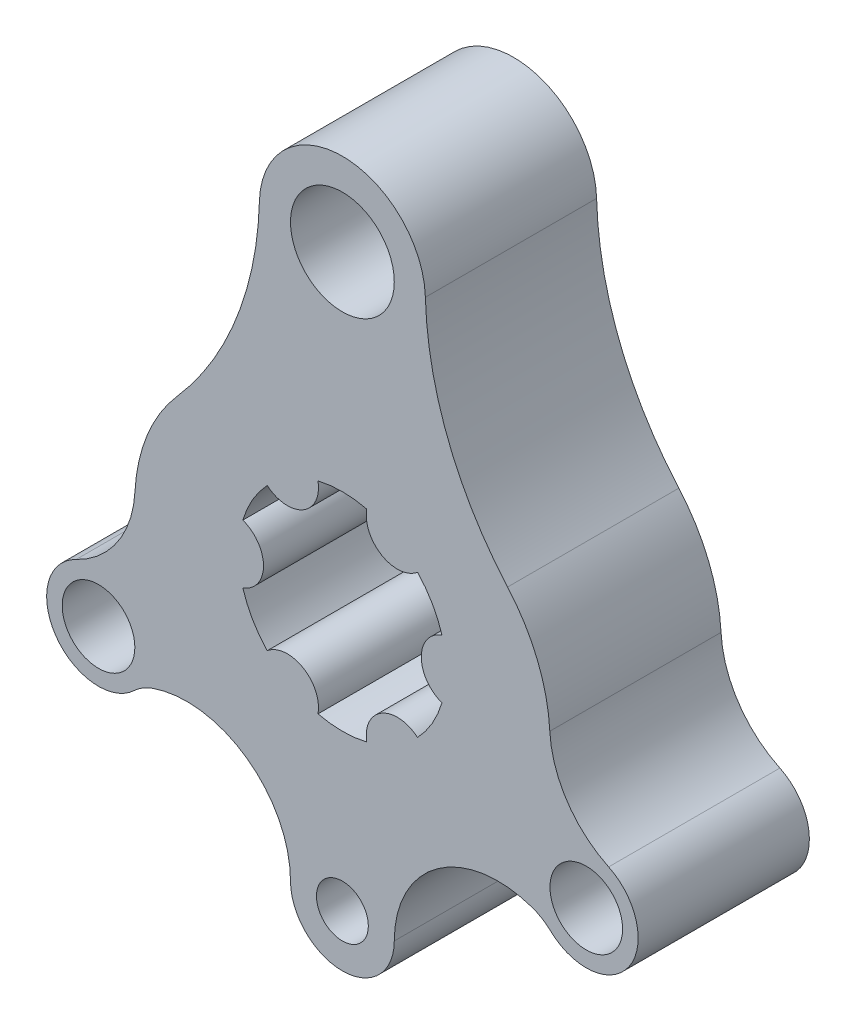
ISO-10303-21;
HEADER;
FILE_DESCRIPTION(('STEP AP214'),'2;1');
FILE_NAME('part.step','',(''),(''),'','','');
FILE_SCHEMA(('AUTOMOTIVE_DESIGN { 1 0 10303 214 1 1 1 1 }'));
ENDSEC;
DATA;
#1=APPLICATION_CONTEXT('core data for automotive mechanical design processes');
#2=APPLICATION_PROTOCOL_DEFINITION('international standard','automotive_design',2000,#1);
#3=PRODUCT_CONTEXT('',#1,'mechanical');
#4=PRODUCT('Part','Part','',(#3));
#5=PRODUCT_RELATED_PRODUCT_CATEGORY('part','',(#4));
#6=PRODUCT_DEFINITION_FORMATION('','',#4);
#7=PRODUCT_DEFINITION_CONTEXT('part definition',#1,'design');
#8=PRODUCT_DEFINITION('design','',#6,#7);
#9=PRODUCT_DEFINITION_SHAPE('','',#8);
#10=(LENGTH_UNIT() NAMED_UNIT(*) SI_UNIT(.MILLI.,.METRE.));
#11=(NAMED_UNIT(*) PLANE_ANGLE_UNIT() SI_UNIT($,.RADIAN.));
#12=(NAMED_UNIT(*) SI_UNIT($,.STERADIAN.) SOLID_ANGLE_UNIT());
#13=UNCERTAINTY_MEASURE_WITH_UNIT(LENGTH_MEASURE(1.E-05),#10,'distance_accuracy_value','');
#14=(GEOMETRIC_REPRESENTATION_CONTEXT(3) GLOBAL_UNCERTAINTY_ASSIGNED_CONTEXT((#13)) GLOBAL_UNIT_ASSIGNED_CONTEXT((#10,
#11,#12)) REPRESENTATION_CONTEXT('',''));
#15=CARTESIAN_POINT('',(0.,0.,0.));
#16=DIRECTION('',(0.,0.,1.));
#17=DIRECTION('',(1.,0.,0.));
#18=AXIS2_PLACEMENT_3D('',#15,#16,#17);
#19=CARTESIAN_POINT('',(0.,0.,33.));
#20=DIRECTION('',(0.,0.,-1.));
#21=DIRECTION('',(-1.,0.,0.));
#22=AXIS2_PLACEMENT_3D('',#19,#20,#21);
#23=CYLINDRICAL_SURFACE('',#22,20.);
#24=CARTESIAN_POINT('',(0.,0.,0.));
#25=DIRECTION('',(0.,0.,1.));
#26=DIRECTION('',(1.,0.,0.));
#27=AXIS2_PLACEMENT_3D('',#24,#25,#26);
#28=CIRCLE('',#27,20.);
#29=CARTESIAN_POINT('',(-19.1851005151871,5.65083340952174,0.));
#30=VERTEX_POINT('',#29);
#31=CARTESIAN_POINT('',(-14.486315542793,13.7893677155493,0.));
#32=VERTEX_POINT('',#31);
#33=EDGE_CURVE('E322',#30,#32,#28,.F.);
#34=ORIENTED_EDGE('',*,*,#33,.T.);
#35=DIRECTION('',(0.,0.,-1.));
#36=VECTOR('',#35,1.);
#37=CARTESIAN_POINT('',(-14.486315542793,13.7893677155493,33.));
#38=LINE('',#37,#36);
#39=CARTESIAN_POINT('',(-14.486315542793,13.7893677155493,33.));
#40=VERTEX_POINT('',#39);
#41=EDGE_CURVE('E11',#40,#32,#38,.T.);
#42=ORIENTED_EDGE('',*,*,#41,.F.);
#43=CARTESIAN_POINT('',(0.,0.,33.));
#44=DIRECTION('',(0.,0.,1.));
#45=DIRECTION('',(1.,0.,0.));
#46=AXIS2_PLACEMENT_3D('',#43,#44,#45);
#47=CIRCLE('',#46,20.);
#48=CARTESIAN_POINT('',(-19.1851005151871,5.65083340952174,33.));
#49=VERTEX_POINT('',#48);
#50=EDGE_CURVE('E556',#49,#40,#47,.F.);
#51=ORIENTED_EDGE('',*,*,#50,.F.);
#52=DIRECTION('',(0.,0.,-1.));
#53=VECTOR('',#52,1.);
#54=CARTESIAN_POINT('',(-19.1851005151871,5.65083340952174,33.));
#55=LINE('',#54,#53);
#56=EDGE_CURVE('E357',#49,#30,#55,.T.);
#57=ORIENTED_EDGE('',*,*,#56,.T.);
#58=EDGE_LOOP('',(#34,#42,#51,#57));
#59=FACE_BOUND('',#58,.T.);
#60=ADVANCED_FACE('F41',(#59),#23,.F.);
#61=CARTESIAN_POINT('',(-10.6010245728135,18.3615131723997,33.));
#62=DIRECTION('',(0.,0.,-1.));
#63=DIRECTION('',(-1.,0.,0.));
#64=AXIS2_PLACEMENT_3D('',#61,#62,#63);
#65=CYLINDRICAL_SURFACE('',#64,5.99999999999993);
#66=CARTESIAN_POINT('',(-10.6010245728135,18.3615131723997,0.));
#67=DIRECTION('',(0.,0.,1.));
#68=DIRECTION('',(1.,0.,0.));
#69=AXIS2_PLACEMENT_3D('',#66,#67,#68);
#70=CIRCLE('',#69,5.99999999999993);
#71=CARTESIAN_POINT('',(-4.69878497239411,19.4402011250708,0.));
#72=VERTEX_POINT('',#71);
#73=EDGE_CURVE('E326',#32,#72,#70,.T.);
#74=ORIENTED_EDGE('',*,*,#73,.T.);
#75=DIRECTION('',(0.,0.,-1.));
#76=VECTOR('',#75,1.);
#77=CARTESIAN_POINT('',(-4.69878497239411,19.4402011250708,33.));
#78=LINE('',#77,#76);
#79=CARTESIAN_POINT('',(-4.69878497239411,19.4402011250708,33.));
#80=VERTEX_POINT('',#79);
#81=EDGE_CURVE('E52',#80,#72,#78,.T.);
#82=ORIENTED_EDGE('',*,*,#81,.F.);
#83=CARTESIAN_POINT('',(-10.6010245728135,18.3615131723997,33.));
#84=DIRECTION('',(0.,0.,1.));
#85=DIRECTION('',(1.,0.,0.));
#86=AXIS2_PLACEMENT_3D('',#83,#84,#85);
#87=CIRCLE('',#86,5.99999999999993);
#88=EDGE_CURVE('E559',#40,#80,#87,.T.);
#89=ORIENTED_EDGE('',*,*,#88,.F.);
#90=ORIENTED_EDGE('',*,*,#41,.T.);
#91=EDGE_LOOP('',(#74,#82,#89,#90));
#92=FACE_BOUND('',#91,.T.);
#93=ADVANCED_FACE('F609',(#92),#65,.T.);
#94=CARTESIAN_POINT('',(0.,0.,33.));
#95=DIRECTION('',(0.,0.,-1.));
#96=DIRECTION('',(-1.,0.,0.));
#97=AXIS2_PLACEMENT_3D('',#94,#95,#96);
#98=CYLINDRICAL_SURFACE('',#97,20.);
#99=CARTESIAN_POINT('',(0.,0.,0.));
#100=DIRECTION('',(0.,0.,1.));
#101=DIRECTION('',(1.,0.,0.));
#102=AXIS2_PLACEMENT_3D('',#99,#100,#101);
#103=CIRCLE('',#102,20.);
#104=CARTESIAN_POINT('',(4.69878497239398,19.4402011250708,0.));
#105=VERTEX_POINT('',#104);
#106=EDGE_CURVE('E329',#72,#105,#103,.F.);
#107=ORIENTED_EDGE('',*,*,#106,.T.);
#108=DIRECTION('',(0.,0.,-1.));
#109=VECTOR('',#108,1.);
#110=CARTESIAN_POINT('',(4.69878497239398,19.4402011250708,33.));
#111=LINE('',#110,#109);
#112=CARTESIAN_POINT('',(4.69878497239398,19.4402011250708,33.));
#113=VERTEX_POINT('',#112);
#114=EDGE_CURVE('E384',#113,#105,#111,.T.);
#115=ORIENTED_EDGE('',*,*,#114,.F.);
#116=CARTESIAN_POINT('',(0.,0.,33.));
#117=DIRECTION('',(0.,0.,1.));
#118=DIRECTION('',(1.,0.,0.));
#119=AXIS2_PLACEMENT_3D('',#116,#117,#118);
#120=CIRCLE('',#119,20.);
#121=EDGE_CURVE('E562',#80,#113,#120,.F.);
#122=ORIENTED_EDGE('',*,*,#121,.F.);
#123=ORIENTED_EDGE('',*,*,#81,.T.);
#124=EDGE_LOOP('',(#107,#115,#122,#123));
#125=FACE_BOUND('',#124,.T.);
#126=ADVANCED_FACE('F614',(#125),#98,.F.);
#127=CARTESIAN_POINT('',(10.6010245728138,18.3615131723996,33.));
#128=DIRECTION('',(0.,0.,-1.));
#129=DIRECTION('',(-1.,0.,0.));
#130=AXIS2_PLACEMENT_3D('',#127,#128,#129);
#131=CYLINDRICAL_SURFACE('',#130,6.00000000000007);
#132=CARTESIAN_POINT('',(10.6010245728138,18.3615131723996,0.));
#133=DIRECTION('',(0.,0.,1.));
#134=DIRECTION('',(1.,0.,0.));
#135=AXIS2_PLACEMENT_3D('',#132,#133,#134);
#136=CIRCLE('',#135,6.00000000000007);
#137=CARTESIAN_POINT('',(14.4863155427931,13.7893677155492,0.));
#138=VERTEX_POINT('',#137);
#139=EDGE_CURVE('E332',#105,#138,#136,.T.);
#140=ORIENTED_EDGE('',*,*,#139,.T.);
#141=DIRECTION('',(0.,0.,-1.));
#142=VECTOR('',#141,1.);
#143=CARTESIAN_POINT('',(14.4863155427931,13.7893677155492,33.));
#144=LINE('',#143,#142);
#145=CARTESIAN_POINT('',(14.4863155427931,13.7893677155492,33.));
#146=VERTEX_POINT('',#145);
#147=EDGE_CURVE('E380',#146,#138,#144,.T.);
#148=ORIENTED_EDGE('',*,*,#147,.F.);
#149=CARTESIAN_POINT('',(10.6010245728138,18.3615131723996,33.));
#150=DIRECTION('',(0.,0.,1.));
#151=DIRECTION('',(1.,0.,0.));
#152=AXIS2_PLACEMENT_3D('',#149,#150,#151);
#153=CIRCLE('',#152,6.00000000000007);
#154=EDGE_CURVE('E565',#113,#146,#153,.T.);
#155=ORIENTED_EDGE('',*,*,#154,.F.);
#156=ORIENTED_EDGE('',*,*,#114,.T.);
#157=EDGE_LOOP('',(#140,#148,#155,#156));
#158=FACE_BOUND('',#157,.T.);
#159=ADVANCED_FACE('F684',(#158),#131,.T.);
#160=CARTESIAN_POINT('',(0.,0.,33.));
#161=DIRECTION('',(0.,0.,-1.));
#162=DIRECTION('',(-1.,0.,0.));
#163=AXIS2_PLACEMENT_3D('',#160,#161,#162);
#164=CYLINDRICAL_SURFACE('',#163,20.);
#165=CARTESIAN_POINT('',(0.,0.,0.));
#166=DIRECTION('',(0.,0.,1.));
#167=DIRECTION('',(1.,0.,0.));
#168=AXIS2_PLACEMENT_3D('',#165,#166,#167);
#169=CIRCLE('',#168,20.);
#170=CARTESIAN_POINT('',(19.1851005151871,5.6508334095216,0.));
#171=VERTEX_POINT('',#170);
#172=EDGE_CURVE('E335',#138,#171,#169,.F.);
#173=ORIENTED_EDGE('',*,*,#172,.T.);
#174=DIRECTION('',(0.,0.,-1.));
#175=VECTOR('',#174,1.);
#176=CARTESIAN_POINT('',(19.1851005151871,5.6508334095216,33.));
#177=LINE('',#176,#175);
#178=CARTESIAN_POINT('',(19.1851005151871,5.6508334095216,33.));
#179=VERTEX_POINT('',#178);
#180=EDGE_CURVE('E376',#179,#171,#177,.T.);
#181=ORIENTED_EDGE('',*,*,#180,.F.);
#182=CARTESIAN_POINT('',(0.,0.,33.));
#183=DIRECTION('',(0.,0.,1.));
#184=DIRECTION('',(1.,0.,0.));
#185=AXIS2_PLACEMENT_3D('',#182,#183,#184);
#186=CIRCLE('',#185,20.);
#187=EDGE_CURVE('E568',#146,#179,#186,.F.);
#188=ORIENTED_EDGE('',*,*,#187,.F.);
#189=ORIENTED_EDGE('',*,*,#147,.T.);
#190=EDGE_LOOP('',(#173,#181,#188,#189));
#191=FACE_BOUND('',#190,.T.);
#192=ADVANCED_FACE('F680',(#191),#164,.F.);
#193=CARTESIAN_POINT('',(21.2020491456275,0.,33.));
#194=DIRECTION('',(0.,0.,-1.));
#195=DIRECTION('',(-1.,0.,0.));
#196=AXIS2_PLACEMENT_3D('',#193,#194,#195);
#197=CYLINDRICAL_SURFACE('',#196,6.00000000000008);
#198=CARTESIAN_POINT('',(21.2020491456275,0.,0.));
#199=DIRECTION('',(0.,0.,1.));
#200=DIRECTION('',(1.,0.,0.));
#201=AXIS2_PLACEMENT_3D('',#198,#199,#200);
#202=CIRCLE('',#201,6.00000000000008);
#203=CARTESIAN_POINT('',(19.1851005151871,-5.65083340952161,0.));
#204=VERTEX_POINT('',#203);
#205=EDGE_CURVE('E338',#171,#204,#202,.T.);
#206=ORIENTED_EDGE('',*,*,#205,.T.);
#207=DIRECTION('',(0.,0.,-1.));
#208=VECTOR('',#207,1.);
#209=CARTESIAN_POINT('',(19.1851005151871,-5.65083340952161,33.));
#210=LINE('',#209,#208);
#211=CARTESIAN_POINT('',(19.1851005151871,-5.65083340952161,33.));
#212=VERTEX_POINT('',#211);
#213=EDGE_CURVE('E372',#212,#204,#210,.T.);
#214=ORIENTED_EDGE('',*,*,#213,.F.);
#215=CARTESIAN_POINT('',(21.2020491456275,0.,33.));
#216=DIRECTION('',(0.,0.,1.));
#217=DIRECTION('',(1.,0.,0.));
#218=AXIS2_PLACEMENT_3D('',#215,#216,#217);
#219=CIRCLE('',#218,6.00000000000008);
#220=EDGE_CURVE('E571',#179,#212,#219,.T.);
#221=ORIENTED_EDGE('',*,*,#220,.F.);
#222=ORIENTED_EDGE('',*,*,#180,.T.);
#223=EDGE_LOOP('',(#206,#214,#221,#222));
#224=FACE_BOUND('',#223,.T.);
#225=ADVANCED_FACE('F676',(#224),#197,.T.);
#226=CARTESIAN_POINT('',(0.,0.,33.));
#227=DIRECTION('',(0.,0.,-1.));
#228=DIRECTION('',(-1.,0.,0.));
#229=AXIS2_PLACEMENT_3D('',#226,#227,#228);
#230=CYLINDRICAL_SURFACE('',#229,20.);
#231=CARTESIAN_POINT('',(0.,0.,0.));
#232=DIRECTION('',(0.,0.,1.));
#233=DIRECTION('',(1.,0.,0.));
#234=AXIS2_PLACEMENT_3D('',#231,#232,#233);
#235=CIRCLE('',#234,20.);
#236=CARTESIAN_POINT('',(14.4863155427931,-13.7893677155492,0.));
#237=VERTEX_POINT('',#236);
#238=EDGE_CURVE('E341',#204,#237,#235,.F.);
#239=ORIENTED_EDGE('',*,*,#238,.T.);
#240=DIRECTION('',(0.,0.,-1.));
#241=VECTOR('',#240,1.);
#242=CARTESIAN_POINT('',(14.4863155427931,-13.7893677155492,33.));
#243=LINE('',#242,#241);
#244=CARTESIAN_POINT('',(14.4863155427931,-13.7893677155492,33.));
#245=VERTEX_POINT('',#244);
#246=EDGE_CURVE('E368',#245,#237,#243,.T.);
#247=ORIENTED_EDGE('',*,*,#246,.F.);
#248=CARTESIAN_POINT('',(0.,0.,33.));
#249=DIRECTION('',(0.,0.,1.));
#250=DIRECTION('',(1.,0.,0.));
#251=AXIS2_PLACEMENT_3D('',#248,#249,#250);
#252=CIRCLE('',#251,20.);
#253=EDGE_CURVE('E574',#212,#245,#252,.F.);
#254=ORIENTED_EDGE('',*,*,#253,.F.);
#255=ORIENTED_EDGE('',*,*,#213,.T.);
#256=EDGE_LOOP('',(#239,#247,#254,#255));
#257=FACE_BOUND('',#256,.T.);
#258=ADVANCED_FACE('F673',(#257),#230,.F.);
#259=CARTESIAN_POINT('',(10.6010245728136,-18.3615131723997,33.));
#260=DIRECTION('',(0.,0.,-1.));
#261=DIRECTION('',(-1.,0.,0.));
#262=AXIS2_PLACEMENT_3D('',#259,#260,#261);
#263=CYLINDRICAL_SURFACE('',#262,6.00000000000007);
#264=CARTESIAN_POINT('',(10.6010245728136,-18.3615131723997,0.));
#265=DIRECTION('',(0.,0.,1.));
#266=DIRECTION('',(1.,0.,0.));
#267=AXIS2_PLACEMENT_3D('',#264,#265,#266);
#268=CIRCLE('',#267,6.00000000000007);
#269=CARTESIAN_POINT('',(4.69878497239398,-19.4402011250708,0.));
#270=VERTEX_POINT('',#269);
#271=EDGE_CURVE('E344',#237,#270,#268,.T.);
#272=ORIENTED_EDGE('',*,*,#271,.T.);
#273=DIRECTION('',(0.,0.,-1.));
#274=VECTOR('',#273,1.);
#275=CARTESIAN_POINT('',(4.69878497239398,-19.4402011250708,33.));
#276=LINE('',#275,#274);
#277=CARTESIAN_POINT('',(4.69878497239398,-19.4402011250708,33.));
#278=VERTEX_POINT('',#277);
#279=EDGE_CURVE('E364',#278,#270,#276,.T.);
#280=ORIENTED_EDGE('',*,*,#279,.F.);
#281=CARTESIAN_POINT('',(10.6010245728136,-18.3615131723997,33.));
#282=DIRECTION('',(0.,0.,1.));
#283=DIRECTION('',(1.,0.,0.));
#284=AXIS2_PLACEMENT_3D('',#281,#282,#283);
#285=CIRCLE('',#284,6.00000000000007);
#286=EDGE_CURVE('E577',#245,#278,#285,.T.);
#287=ORIENTED_EDGE('',*,*,#286,.F.);
#288=ORIENTED_EDGE('',*,*,#246,.T.);
#289=EDGE_LOOP('',(#272,#280,#287,#288));
#290=FACE_BOUND('',#289,.T.);
#291=ADVANCED_FACE('F585',(#290),#263,.T.);
#292=CARTESIAN_POINT('',(0.,0.,33.));
#293=DIRECTION('',(0.,0.,-1.));
#294=DIRECTION('',(-1.,0.,0.));
#295=AXIS2_PLACEMENT_3D('',#292,#293,#294);
#296=CYLINDRICAL_SURFACE('',#295,20.);
#297=CARTESIAN_POINT('',(0.,0.,0.));
#298=DIRECTION('',(0.,0.,1.));
#299=DIRECTION('',(1.,0.,0.));
#300=AXIS2_PLACEMENT_3D('',#297,#298,#299);
#301=CIRCLE('',#300,20.);
#302=CARTESIAN_POINT('',(-4.69878497239411,-19.4402011250708,0.));
#303=VERTEX_POINT('',#302);
#304=EDGE_CURVE('E347',#270,#303,#301,.F.);
#305=ORIENTED_EDGE('',*,*,#304,.T.);
#306=DIRECTION('',(0.,0.,-1.));
#307=VECTOR('',#306,1.);
#308=CARTESIAN_POINT('',(-4.69878497239411,-19.4402011250708,33.));
#309=LINE('',#308,#307);
#310=CARTESIAN_POINT('',(-4.69878497239411,-19.4402011250708,33.));
#311=VERTEX_POINT('',#310);
#312=EDGE_CURVE('E243',#311,#303,#309,.T.);
#313=ORIENTED_EDGE('',*,*,#312,.F.);
#314=CARTESIAN_POINT('',(0.,0.,33.));
#315=DIRECTION('',(0.,0.,1.));
#316=DIRECTION('',(1.,0.,0.));
#317=AXIS2_PLACEMENT_3D('',#314,#315,#316);
#318=CIRCLE('',#317,20.);
#319=EDGE_CURVE('E232',#278,#311,#318,.F.);
#320=ORIENTED_EDGE('',*,*,#319,.F.);
#321=ORIENTED_EDGE('',*,*,#279,.T.);
#322=EDGE_LOOP('',(#305,#313,#320,#321));
#323=FACE_BOUND('',#322,.T.);
#324=ADVANCED_FACE('F589',(#323),#296,.F.);
#325=CARTESIAN_POINT('',(-10.6010245728139,-18.3615131723995,33.));
#326=DIRECTION('',(0.,0.,-1.));
#327=DIRECTION('',(-1.,0.,0.));
#328=AXIS2_PLACEMENT_3D('',#325,#326,#327);
#329=CYLINDRICAL_SURFACE('',#328,6.00000000000007);
#330=CARTESIAN_POINT('',(-10.6010245728139,-18.3615131723995,0.));
#331=DIRECTION('',(0.,0.,1.));
#332=DIRECTION('',(1.,0.,0.));
#333=AXIS2_PLACEMENT_3D('',#330,#331,#332);
#334=CIRCLE('',#333,6.00000000000007);
#335=CARTESIAN_POINT('',(-14.4863155427932,-13.7893677155491,0.));
#336=VERTEX_POINT('',#335);
#337=EDGE_CURVE('E241',#303,#336,#334,.T.);
#338=ORIENTED_EDGE('',*,*,#337,.T.);
#339=DIRECTION('',(0.,0.,-1.));
#340=VECTOR('',#339,1.);
#341=CARTESIAN_POINT('',(-14.4863155427932,-13.7893677155491,33.));
#342=LINE('',#341,#340);
#343=CARTESIAN_POINT('',(-14.4863155427932,-13.7893677155491,33.));
#344=VERTEX_POINT('',#343);
#345=EDGE_CURVE('E238',#344,#336,#342,.T.);
#346=ORIENTED_EDGE('',*,*,#345,.F.);
#347=CARTESIAN_POINT('',(-10.6010245728139,-18.3615131723995,33.));
#348=DIRECTION('',(0.,0.,1.));
#349=DIRECTION('',(1.,0.,0.));
#350=AXIS2_PLACEMENT_3D('',#347,#348,#349);
#351=CIRCLE('',#350,6.00000000000007);
#352=EDGE_CURVE('E226',#311,#344,#351,.T.);
#353=ORIENTED_EDGE('',*,*,#352,.F.);
#354=ORIENTED_EDGE('',*,*,#312,.T.);
#355=EDGE_LOOP('',(#338,#346,#353,#354));
#356=FACE_BOUND('',#355,.T.);
#357=ADVANCED_FACE('F239',(#356),#329,.T.);
#358=CARTESIAN_POINT('',(0.,0.,33.));
#359=DIRECTION('',(0.,0.,-1.));
#360=DIRECTION('',(-1.,0.,0.));
#361=AXIS2_PLACEMENT_3D('',#358,#359,#360);
#362=CYLINDRICAL_SURFACE('',#361,20.);
#363=CARTESIAN_POINT('',(0.,0.,0.));
#364=DIRECTION('',(0.,0.,1.));
#365=DIRECTION('',(1.,0.,0.));
#366=AXIS2_PLACEMENT_3D('',#363,#364,#365);
#367=CIRCLE('',#366,20.);
#368=CARTESIAN_POINT('',(-19.1851005151872,-5.65083340952147,0.));
#369=VERTEX_POINT('',#368);
#370=EDGE_CURVE('E144',#336,#369,#367,.F.);
#371=ORIENTED_EDGE('',*,*,#370,.T.);
#372=DIRECTION('',(0.,0.,-1.));
#373=VECTOR('',#372,1.);
#374=CARTESIAN_POINT('',(-19.1851005151872,-5.65083340952147,33.));
#375=LINE('',#374,#373);
#376=CARTESIAN_POINT('',(-19.1851005151872,-5.65083340952147,33.));
#377=VERTEX_POINT('',#376);
#378=EDGE_CURVE('E244',#377,#369,#375,.T.);
#379=ORIENTED_EDGE('',*,*,#378,.F.);
#380=CARTESIAN_POINT('',(0.,0.,33.));
#381=DIRECTION('',(0.,0.,1.));
#382=DIRECTION('',(1.,0.,0.));
#383=AXIS2_PLACEMENT_3D('',#380,#381,#382);
#384=CIRCLE('',#383,20.);
#385=EDGE_CURVE('E230',#344,#377,#384,.F.);
#386=ORIENTED_EDGE('',*,*,#385,.F.);
#387=ORIENTED_EDGE('',*,*,#345,.T.);
#388=EDGE_LOOP('',(#371,#379,#386,#387));
#389=FACE_BOUND('',#388,.T.);
#390=ADVANCED_FACE('F246',(#389),#362,.F.);
#391=CARTESIAN_POINT('',(0.,60.,33.));
#392=DIRECTION('',(0.,0.,-1.));
#393=DIRECTION('',(-1.,0.,0.));
#394=AXIS2_PLACEMENT_3D('',#391,#392,#393);
#395=CYLINDRICAL_SURFACE('',#394,16.);
#396=CARTESIAN_POINT('',(0.,60.,0.));
#397=DIRECTION('',(0.,0.,1.));
#398=DIRECTION('',(1.,0.,0.));
#399=AXIS2_PLACEMENT_3D('',#396,#397,#398);
#400=CIRCLE('',#399,16.);
#401=CARTESIAN_POINT('',(-15.9940333687137,60.4369171551578,0.));
#402=VERTEX_POINT('',#401);
#403=CARTESIAN_POINT('',(15.9940333687137,60.436917155158,0.));
#404=VERTEX_POINT('',#403);
#405=EDGE_CURVE('E254',#402,#404,#400,.F.);
#406=ORIENTED_EDGE('',*,*,#405,.F.);
#407=DIRECTION('',(0.,0.,-1.));
#408=VECTOR('',#407,1.);
#409=CARTESIAN_POINT('',(-15.9940333687137,60.4369171551578,33.));
#410=LINE('',#409,#408);
#411=CARTESIAN_POINT('',(-15.9940333687137,60.4369171551578,33.));
#412=VERTEX_POINT('',#411);
#413=EDGE_CURVE('E45',#412,#402,#410,.T.);
#414=ORIENTED_EDGE('',*,*,#413,.F.);
#415=CARTESIAN_POINT('',(0.,60.,33.));
#416=DIRECTION('',(0.,0.,1.));
#417=DIRECTION('',(1.,0.,0.));
#418=AXIS2_PLACEMENT_3D('',#415,#416,#417);
#419=CIRCLE('',#418,16.);
#420=CARTESIAN_POINT('',(15.9940333687137,60.436917155158,33.));
#421=VERTEX_POINT('',#420);
#422=EDGE_CURVE('E356',#412,#421,#419,.F.);
#423=ORIENTED_EDGE('',*,*,#422,.T.);
#424=DIRECTION('',(0.,0.,-1.));
#425=VECTOR('',#424,1.);
#426=CARTESIAN_POINT('',(15.9940333687137,60.436917155158,33.));
#427=LINE('',#426,#425);
#428=EDGE_CURVE('E250',#421,#404,#427,.T.);
#429=ORIENTED_EDGE('',*,*,#428,.T.);
#430=EDGE_LOOP('',(#406,#414,#423,#429));
#431=FACE_BOUND('',#430,.T.);
#432=ADVANCED_FACE('F43',(#431),#395,.T.);
#433=CARTESIAN_POINT('',(-79.9701668435691,62.1845857757893,33.));
#434=DIRECTION('',(0.,0.,-1.));
#435=DIRECTION('',(-1.,0.,0.));
#436=AXIS2_PLACEMENT_3D('',#433,#434,#435);
#437=CYLINDRICAL_SURFACE('',#436,63.9999999999999);
#438=CARTESIAN_POINT('',(-79.9701668435691,62.1845857757893,0.));
#439=DIRECTION('',(0.,0.,1.));
#440=DIRECTION('',(1.,0.,0.));
#441=AXIS2_PLACEMENT_3D('',#438,#439,#440);
#442=CIRCLE('',#441,63.9999999999999);
#443=CARTESIAN_POINT('',(-31.8405426717033,19.9999999999998,0.));
#444=VERTEX_POINT('',#443);
#445=EDGE_CURVE('E258',#402,#444,#442,.F.);
#446=ORIENTED_EDGE('',*,*,#445,.T.);
#447=DIRECTION('',(0.,0.,-1.));
#448=VECTOR('',#447,1.);
#449=CARTESIAN_POINT('',(-31.8405426717033,19.9999999999998,33.));
#450=LINE('',#449,#448);
#451=CARTESIAN_POINT('',(-31.8405426717033,19.9999999999998,33.));
#452=VERTEX_POINT('',#451);
#453=EDGE_CURVE('E428',#452,#444,#450,.T.);
#454=ORIENTED_EDGE('',*,*,#453,.F.);
#455=CARTESIAN_POINT('',(-79.9701668435691,62.1845857757893,33.));
#456=DIRECTION('',(0.,0.,1.));
#457=DIRECTION('',(1.,0.,0.));
#458=AXIS2_PLACEMENT_3D('',#455,#456,#457);
#459=CIRCLE('',#458,63.9999999999999);
#460=EDGE_CURVE('E439',#412,#452,#459,.F.);
#461=ORIENTED_EDGE('',*,*,#460,.F.);
#462=ORIENTED_EDGE('',*,*,#413,.T.);
#463=EDGE_LOOP('',(#446,#454,#461,#462));
#464=FACE_BOUND('',#463,.T.);
#465=ADVANCED_FACE('F438',(#464),#437,.F.);
#466=CARTESIAN_POINT('',(-7.02370520808498,-1.75142704064168,33.));
#467=DIRECTION('',(0.,0.,-1.));
#468=DIRECTION('',(-1.,0.,0.));
#469=AXIS2_PLACEMENT_3D('',#466,#467,#468);
#470=CYLINDRICAL_SURFACE('',#469,33.);
#471=CARTESIAN_POINT('',(-7.02370520808498,-1.75142704064168,0.));
#472=DIRECTION('',(0.,0.,1.));
#473=DIRECTION('',(1.,0.,0.));
#474=AXIS2_PLACEMENT_3D('',#471,#472,#473);
#475=CIRCLE('',#474,33.);
#476=CARTESIAN_POINT('',(-39.9771952102275,-2.15322551455621E-13,0.));
#477=VERTEX_POINT('',#476);
#478=EDGE_CURVE('E261',#444,#477,#475,.T.);
#479=ORIENTED_EDGE('',*,*,#478,.T.);
#480=DIRECTION('',(0.,0.,-1.));
#481=VECTOR('',#480,1.);
#482=CARTESIAN_POINT('',(-39.9771952102275,-2.15322551455621E-13,33.));
#483=LINE('',#482,#481);
#484=CARTESIAN_POINT('',(-39.9771952102275,-2.15322551455621E-13,33.));
#485=VERTEX_POINT('',#484);
#486=EDGE_CURVE('E425',#485,#477,#483,.T.);
#487=ORIENTED_EDGE('',*,*,#486,.F.);
#488=CARTESIAN_POINT('',(-7.02370520808498,-1.75142704064168,33.));
#489=DIRECTION('',(0.,0.,1.));
#490=DIRECTION('',(1.,0.,0.));
#491=AXIS2_PLACEMENT_3D('',#488,#489,#490);
#492=CIRCLE('',#491,33.);
#493=EDGE_CURVE('E505',#452,#485,#492,.T.);
#494=ORIENTED_EDGE('',*,*,#493,.F.);
#495=ORIENTED_EDGE('',*,*,#453,.T.);
#496=EDGE_LOOP('',(#479,#487,#494,#495));
#497=FACE_BOUND('',#496,.T.);
#498=ADVANCED_FACE('F504',(#497),#470,.T.);
#499=CARTESIAN_POINT('',(-59.9490073327382,1.06147093372178,33.));
#500=DIRECTION('',(0.,0.,-1.));
#501=DIRECTION('',(-1.,0.,0.));
#502=AXIS2_PLACEMENT_3D('',#499,#500,#501);
#503=CYLINDRICAL_SURFACE('',#502,20.);
#504=CARTESIAN_POINT('',(-59.9490073327382,1.06147093372178,0.));
#505=DIRECTION('',(0.,0.,1.));
#506=DIRECTION('',(1.,0.,0.));
#507=AXIS2_PLACEMENT_3D('',#504,#505,#506);
#508=CIRCLE('',#507,20.);
#509=CARTESIAN_POINT('',(-51.3163357775793,-16.9795096887596,0.));
#510=VERTEX_POINT('',#509);
#511=EDGE_CURVE('E264',#477,#510,#508,.F.);
#512=ORIENTED_EDGE('',*,*,#511,.T.);
#513=DIRECTION('',(0.,0.,-1.));
#514=VECTOR('',#513,1.);
#515=CARTESIAN_POINT('',(-51.3163357775793,-16.9795096887596,33.));
#516=LINE('',#515,#514);
#517=CARTESIAN_POINT('',(-51.3163357775793,-16.9795096887596,33.));
#518=VERTEX_POINT('',#517);
#519=EDGE_CURVE('E421',#518,#510,#516,.T.);
#520=ORIENTED_EDGE('',*,*,#519,.F.);
#521=CARTESIAN_POINT('',(-59.9490073327382,1.06147093372178,33.));
#522=DIRECTION('',(0.,0.,1.));
#523=DIRECTION('',(1.,0.,0.));
#524=AXIS2_PLACEMENT_3D('',#521,#522,#523);
#525=CIRCLE('',#524,20.);
#526=EDGE_CURVE('E503',#485,#518,#525,.F.);
#527=ORIENTED_EDGE('',*,*,#526,.F.);
#528=ORIENTED_EDGE('',*,*,#486,.T.);
#529=EDGE_LOOP('',(#512,#520,#527,#528));
#530=FACE_BOUND('',#529,.T.);
#531=ADVANCED_FACE('F500',(#530),#503,.F.);
#532=CARTESIAN_POINT('',(-46.9999999999998,-26.0000000000002,33.));
#533=DIRECTION('',(0.,0.,-1.));
#534=DIRECTION('',(-1.,0.,0.));
#535=AXIS2_PLACEMENT_3D('',#532,#533,#534);
#536=CYLINDRICAL_SURFACE('',#535,9.99999999999994);
#537=CARTESIAN_POINT('',(-46.9999999999998,-26.0000000000002,0.));
#538=DIRECTION('',(0.,0.,1.));
#539=DIRECTION('',(1.,0.,0.));
#540=AXIS2_PLACEMENT_3D('',#537,#538,#539);
#541=CIRCLE('',#540,9.99999999999994);
#542=CARTESIAN_POINT('',(-40.1410010516561,-33.2769590782569,0.));
#543=VERTEX_POINT('',#542);
#544=EDGE_CURVE('E267',#510,#543,#541,.T.);
#545=ORIENTED_EDGE('',*,*,#544,.T.);
#546=DIRECTION('',(0.,0.,-1.));
#547=VECTOR('',#546,1.);
#548=CARTESIAN_POINT('',(-40.1410010516561,-33.2769590782569,33.));
#549=LINE('',#548,#547);
#550=CARTESIAN_POINT('',(-40.1410010516561,-33.2769590782569,33.));
#551=VERTEX_POINT('',#550);
#552=EDGE_CURVE('E418',#551,#543,#549,.T.);
#553=ORIENTED_EDGE('',*,*,#552,.F.);
#554=CARTESIAN_POINT('',(-46.9999999999998,-26.0000000000002,33.));
#555=DIRECTION('',(0.,0.,1.));
#556=DIRECTION('',(1.,0.,0.));
#557=AXIS2_PLACEMENT_3D('',#554,#555,#556);
#558=CIRCLE('',#557,9.99999999999994);
#559=EDGE_CURVE('E511',#518,#551,#558,.T.);
#560=ORIENTED_EDGE('',*,*,#559,.F.);
#561=ORIENTED_EDGE('',*,*,#519,.T.);
#562=EDGE_LOOP('',(#545,#553,#560,#561));
#563=FACE_BOUND('',#562,.T.);
#564=ADVANCED_FACE('F497',(#563),#536,.T.);
#565=CARTESIAN_POINT('',(-33.2820021033125,-40.5539181565134,33.));
#566=DIRECTION('',(0.,0.,-1.));
#567=DIRECTION('',(-1.,0.,0.));
#568=AXIS2_PLACEMENT_3D('',#565,#566,#567);
#569=CYLINDRICAL_SURFACE('',#568,10.);
#570=CARTESIAN_POINT('',(-33.2820021033125,-40.5539181565134,0.));
#571=DIRECTION('',(0.,0.,1.));
#572=DIRECTION('',(1.,0.,0.));
#573=AXIS2_PLACEMENT_3D('',#570,#571,#572);
#574=CIRCLE('',#573,10.);
#575=CARTESIAN_POINT('',(-36.5640042066253,-31.1078363130267,0.));
#576=VERTEX_POINT('',#575);
#577=EDGE_CURVE('E271',#576,#543,#574,.T.);
#578=ORIENTED_EDGE('',*,*,#577,.F.);
#579=DIRECTION('',(0.,0.,-1.));
#580=VECTOR('',#579,1.);
#581=CARTESIAN_POINT('',(-36.5640042066253,-31.1078363130267,33.));
#582=LINE('',#581,#580);
#583=CARTESIAN_POINT('',(-36.5640042066253,-31.1078363130267,33.));
#584=VERTEX_POINT('',#583);
#585=EDGE_CURVE('E415',#584,#576,#582,.T.);
#586=ORIENTED_EDGE('',*,*,#585,.F.);
#587=CARTESIAN_POINT('',(-33.2820021033125,-40.5539181565134,33.));
#588=DIRECTION('',(0.,0.,1.));
#589=DIRECTION('',(1.,0.,0.));
#590=AXIS2_PLACEMENT_3D('',#587,#588,#589);
#591=CIRCLE('',#590,10.);
#592=EDGE_CURVE('E494',#584,#551,#591,.T.);
#593=ORIENTED_EDGE('',*,*,#592,.T.);
#594=ORIENTED_EDGE('',*,*,#552,.T.);
#595=EDGE_LOOP('',(#578,#586,#593,#594));
#596=FACE_BOUND('',#595,.T.);
#597=ADVANCED_FACE('F489',(#596),#569,.F.);
#598=CARTESIAN_POINT('',(-29.9999999999997,-50.0000000000002,33.));
#599=DIRECTION('',(0.,0.,-1.));
#600=DIRECTION('',(-1.,0.,0.));
#601=AXIS2_PLACEMENT_3D('',#598,#599,#600);
#602=CYLINDRICAL_SURFACE('',#601,20.);
#603=CARTESIAN_POINT('',(-29.9999999999997,-50.0000000000002,0.));
#604=DIRECTION('',(0.,0.,1.));
#605=DIRECTION('',(1.,0.,0.));
#606=AXIS2_PLACEMENT_3D('',#603,#604,#605);
#607=CIRCLE('',#606,20.);
#608=CARTESIAN_POINT('',(-9.99999999999982,-50.,0.));
#609=VERTEX_POINT('',#608);
#610=EDGE_CURVE('E275',#576,#609,#607,.F.);
#611=ORIENTED_EDGE('',*,*,#610,.T.);
#612=DIRECTION('',(0.,0.,-1.));
#613=VECTOR('',#612,1.);
#614=CARTESIAN_POINT('',(-9.99999999999982,-50.,33.));
#615=LINE('',#614,#613);
#616=CARTESIAN_POINT('',(-9.99999999999982,-50.,33.));
#617=VERTEX_POINT('',#616);
#618=EDGE_CURVE('E411',#617,#609,#615,.T.);
#619=ORIENTED_EDGE('',*,*,#618,.F.);
#620=CARTESIAN_POINT('',(-29.9999999999997,-50.0000000000002,33.));
#621=DIRECTION('',(0.,0.,1.));
#622=DIRECTION('',(1.,0.,0.));
#623=AXIS2_PLACEMENT_3D('',#620,#621,#622);
#624=CIRCLE('',#623,20.);
#625=EDGE_CURVE('E520',#584,#617,#624,.F.);
#626=ORIENTED_EDGE('',*,*,#625,.F.);
#627=ORIENTED_EDGE('',*,*,#585,.T.);
#628=EDGE_LOOP('',(#611,#619,#626,#627));
#629=FACE_BOUND('',#628,.T.);
#630=ADVANCED_FACE('F647',(#629),#602,.F.);
#631=CARTESIAN_POINT('',(0.,-50.,33.));
#632=DIRECTION('',(0.,0.,-1.));
#633=DIRECTION('',(-1.,0.,0.));
#634=AXIS2_PLACEMENT_3D('',#631,#632,#633);
#635=CYLINDRICAL_SURFACE('',#634,9.99999999999982);
#636=CARTESIAN_POINT('',(0.,-50.,0.));
#637=DIRECTION('',(0.,0.,1.));
#638=DIRECTION('',(1.,0.,0.));
#639=AXIS2_PLACEMENT_3D('',#636,#637,#638);
#640=CIRCLE('',#639,9.99999999999982);
#641=CARTESIAN_POINT('',(9.99999999999982,-50.,0.));
#642=VERTEX_POINT('',#641);
#643=EDGE_CURVE('E278',#609,#642,#640,.T.);
#644=ORIENTED_EDGE('',*,*,#643,.T.);
#645=DIRECTION('',(0.,0.,-1.));
#646=VECTOR('',#645,1.);
#647=CARTESIAN_POINT('',(9.99999999999982,-50.,33.));
#648=LINE('',#647,#646);
#649=CARTESIAN_POINT('',(9.99999999999982,-50.,33.));
#650=VERTEX_POINT('',#649);
#651=EDGE_CURVE('E408',#650,#642,#648,.T.);
#652=ORIENTED_EDGE('',*,*,#651,.F.);
#653=CARTESIAN_POINT('',(0.,-50.,33.));
#654=DIRECTION('',(0.,0.,1.));
#655=DIRECTION('',(1.,0.,0.));
#656=AXIS2_PLACEMENT_3D('',#653,#654,#655);
#657=CIRCLE('',#656,9.99999999999982);
#658=EDGE_CURVE('E523',#617,#650,#657,.T.);
#659=ORIENTED_EDGE('',*,*,#658,.F.);
#660=ORIENTED_EDGE('',*,*,#618,.T.);
#661=EDGE_LOOP('',(#644,#652,#659,#660));
#662=FACE_BOUND('',#661,.T.);
#663=ADVANCED_FACE('F482',(#662),#635,.T.);
#664=CARTESIAN_POINT('',(30.,-50.,33.));
#665=DIRECTION('',(0.,0.,-1.));
#666=DIRECTION('',(-1.,0.,0.));
#667=AXIS2_PLACEMENT_3D('',#664,#665,#666);
#668=CYLINDRICAL_SURFACE('',#667,20.);
#669=CARTESIAN_POINT('',(30.,-50.,0.));
#670=DIRECTION('',(0.,0.,1.));
#671=DIRECTION('',(1.,0.,0.));
#672=AXIS2_PLACEMENT_3D('',#669,#670,#671);
#673=CIRCLE('',#672,20.);
#674=CARTESIAN_POINT('',(36.5640042066255,-31.1078363130264,0.));
#675=VERTEX_POINT('',#674);
#676=EDGE_CURVE('E282',#675,#642,#673,.T.);
#677=ORIENTED_EDGE('',*,*,#676,.F.);
#678=DIRECTION('',(0.,0.,-1.));
#679=VECTOR('',#678,1.);
#680=CARTESIAN_POINT('',(36.5640042066255,-31.1078363130264,33.));
#681=LINE('',#680,#679);
#682=CARTESIAN_POINT('',(36.5640042066255,-31.1078363130264,33.));
#683=VERTEX_POINT('',#682);
#684=EDGE_CURVE('E405',#683,#675,#681,.T.);
#685=ORIENTED_EDGE('',*,*,#684,.F.);
#686=CARTESIAN_POINT('',(30.,-50.,33.));
#687=DIRECTION('',(0.,0.,1.));
#688=DIRECTION('',(1.,0.,0.));
#689=AXIS2_PLACEMENT_3D('',#686,#687,#688);
#690=CIRCLE('',#689,20.);
#691=EDGE_CURVE('E479',#683,#650,#690,.T.);
#692=ORIENTED_EDGE('',*,*,#691,.T.);
#693=ORIENTED_EDGE('',*,*,#651,.T.);
#694=EDGE_LOOP('',(#677,#685,#692,#693));
#695=FACE_BOUND('',#694,.T.);
#696=ADVANCED_FACE('F474',(#695),#668,.F.);
#697=CARTESIAN_POINT('',(33.2820021033127,-40.5539181565132,33.));
#698=DIRECTION('',(0.,0.,-1.));
#699=DIRECTION('',(-1.,0.,0.));
#700=AXIS2_PLACEMENT_3D('',#697,#698,#699);
#701=CYLINDRICAL_SURFACE('',#700,10.);
#702=CARTESIAN_POINT('',(33.2820021033127,-40.5539181565132,0.));
#703=DIRECTION('',(0.,0.,1.));
#704=DIRECTION('',(1.,0.,0.));
#705=AXIS2_PLACEMENT_3D('',#702,#703,#704);
#706=CIRCLE('',#705,10.);
#707=CARTESIAN_POINT('',(40.1410010516564,-33.2769590782566,0.));
#708=VERTEX_POINT('',#707);
#709=EDGE_CURVE('E286',#675,#708,#706,.F.);
#710=ORIENTED_EDGE('',*,*,#709,.T.);
#711=DIRECTION('',(0.,0.,-1.));
#712=VECTOR('',#711,1.);
#713=CARTESIAN_POINT('',(40.1410010516564,-33.2769590782566,33.));
#714=LINE('',#713,#712);
#715=CARTESIAN_POINT('',(40.1410010516564,-33.2769590782566,33.));
#716=VERTEX_POINT('',#715);
#717=EDGE_CURVE('E402',#716,#708,#714,.T.);
#718=ORIENTED_EDGE('',*,*,#717,.F.);
#719=CARTESIAN_POINT('',(33.2820021033127,-40.5539181565132,33.));
#720=DIRECTION('',(0.,0.,1.));
#721=DIRECTION('',(1.,0.,0.));
#722=AXIS2_PLACEMENT_3D('',#719,#720,#721);
#723=CIRCLE('',#722,10.);
#724=EDGE_CURVE('E528',#683,#716,#723,.F.);
#725=ORIENTED_EDGE('',*,*,#724,.F.);
#726=ORIENTED_EDGE('',*,*,#684,.T.);
#727=EDGE_LOOP('',(#710,#718,#725,#726));
#728=FACE_BOUND('',#727,.T.);
#729=ADVANCED_FACE('F640',(#728),#701,.F.);
#730=CARTESIAN_POINT('',(47.,-26.,33.));
#731=DIRECTION('',(0.,0.,-1.));
#732=DIRECTION('',(-1.,0.,0.));
#733=AXIS2_PLACEMENT_3D('',#730,#731,#732);
#734=CYLINDRICAL_SURFACE('',#733,10.);
#735=CARTESIAN_POINT('',(47.,-26.,0.));
#736=DIRECTION('',(0.,0.,1.));
#737=DIRECTION('',(1.,0.,0.));
#738=AXIS2_PLACEMENT_3D('',#735,#736,#737);
#739=CIRCLE('',#738,10.);
#740=CARTESIAN_POINT('',(51.3163357775794,-16.9795096887593,0.));
#741=VERTEX_POINT('',#740);
#742=EDGE_CURVE('E290',#741,#708,#739,.F.);
#743=ORIENTED_EDGE('',*,*,#742,.F.);
#744=DIRECTION('',(0.,0.,-1.));
#745=VECTOR('',#744,1.);
#746=CARTESIAN_POINT('',(51.3163357775794,-16.9795096887593,33.));
#747=LINE('',#746,#745);
#748=CARTESIAN_POINT('',(51.3163357775794,-16.9795096887593,33.));
#749=VERTEX_POINT('',#748);
#750=EDGE_CURVE('E399',#749,#741,#747,.T.);
#751=ORIENTED_EDGE('',*,*,#750,.F.);
#752=CARTESIAN_POINT('',(47.,-26.,33.));
#753=DIRECTION('',(0.,0.,1.));
#754=DIRECTION('',(1.,0.,0.));
#755=AXIS2_PLACEMENT_3D('',#752,#753,#754);
#756=CIRCLE('',#755,10.);
#757=EDGE_CURVE('E531',#749,#716,#756,.F.);
#758=ORIENTED_EDGE('',*,*,#757,.T.);
#759=ORIENTED_EDGE('',*,*,#717,.T.);
#760=EDGE_LOOP('',(#743,#751,#758,#759));
#761=FACE_BOUND('',#760,.T.);
#762=ADVANCED_FACE('F467',(#761),#734,.T.);
#763=CARTESIAN_POINT('',(59.9490073327382,1.06147093372223,33.));
#764=DIRECTION('',(0.,0.,-1.));
#765=DIRECTION('',(-1.,0.,0.));
#766=AXIS2_PLACEMENT_3D('',#763,#764,#765);
#767=CYLINDRICAL_SURFACE('',#766,20.);
#768=CARTESIAN_POINT('',(59.9490073327382,1.06147093372223,0.));
#769=DIRECTION('',(0.,0.,1.));
#770=DIRECTION('',(1.,0.,0.));
#771=AXIS2_PLACEMENT_3D('',#768,#769,#770);
#772=CIRCLE('',#771,20.);
#773=CARTESIAN_POINT('',(39.9771952102275,0.,0.));
#774=VERTEX_POINT('',#773);
#775=EDGE_CURVE('E294',#774,#741,#772,.T.);
#776=ORIENTED_EDGE('',*,*,#775,.F.);
#777=DIRECTION('',(0.,0.,-1.));
#778=VECTOR('',#777,1.);
#779=CARTESIAN_POINT('',(39.9771952102275,0.,33.));
#780=LINE('',#779,#778);
#781=CARTESIAN_POINT('',(39.9771952102275,0.,33.));
#782=VERTEX_POINT('',#781);
#783=EDGE_CURVE('E396',#782,#774,#780,.T.);
#784=ORIENTED_EDGE('',*,*,#783,.F.);
#785=CARTESIAN_POINT('',(59.9490073327382,1.06147093372223,33.));
#786=DIRECTION('',(0.,0.,1.));
#787=DIRECTION('',(1.,0.,0.));
#788=AXIS2_PLACEMENT_3D('',#785,#786,#787);
#789=CIRCLE('',#788,20.);
#790=EDGE_CURVE('E463',#782,#749,#789,.T.);
#791=ORIENTED_EDGE('',*,*,#790,.T.);
#792=ORIENTED_EDGE('',*,*,#750,.T.);
#793=EDGE_LOOP('',(#776,#784,#791,#792));
#794=FACE_BOUND('',#793,.T.);
#795=ADVANCED_FACE('F461',(#794),#767,.F.);
#796=CARTESIAN_POINT('',(7.02370520808499,-1.75142704064168,33.));
#797=DIRECTION('',(0.,0.,-1.));
#798=DIRECTION('',(-1.,0.,0.));
#799=AXIS2_PLACEMENT_3D('',#796,#797,#798);
#800=CYLINDRICAL_SURFACE('',#799,33.);
#801=CARTESIAN_POINT('',(7.02370520808499,-1.75142704064168,0.));
#802=DIRECTION('',(0.,0.,1.));
#803=DIRECTION('',(1.,0.,0.));
#804=AXIS2_PLACEMENT_3D('',#801,#802,#803);
#805=CIRCLE('',#804,33.);
#806=CARTESIAN_POINT('',(31.8405426717032,20.,0.));
#807=VERTEX_POINT('',#806);
#808=EDGE_CURVE('E298',#807,#774,#805,.F.);
#809=ORIENTED_EDGE('',*,*,#808,.F.);
#810=DIRECTION('',(0.,0.,-1.));
#811=VECTOR('',#810,1.);
#812=CARTESIAN_POINT('',(31.8405426717032,20.,33.));
#813=LINE('',#812,#811);
#814=CARTESIAN_POINT('',(31.8405426717032,20.,33.));
#815=VERTEX_POINT('',#814);
#816=EDGE_CURVE('E393',#815,#807,#813,.T.);
#817=ORIENTED_EDGE('',*,*,#816,.F.);
#818=CARTESIAN_POINT('',(7.02370520808499,-1.75142704064168,33.));
#819=DIRECTION('',(0.,0.,1.));
#820=DIRECTION('',(1.,0.,0.));
#821=AXIS2_PLACEMENT_3D('',#818,#819,#820);
#822=CIRCLE('',#821,33.);
#823=EDGE_CURVE('E457',#815,#782,#822,.F.);
#824=ORIENTED_EDGE('',*,*,#823,.T.);
#825=ORIENTED_EDGE('',*,*,#783,.T.);
#826=EDGE_LOOP('',(#809,#817,#824,#825));
#827=FACE_BOUND('',#826,.T.);
#828=ADVANCED_FACE('F454',(#827),#800,.T.);
#829=CARTESIAN_POINT('',(0.,60.,33.));
#830=DIRECTION('',(0.,0.,-1.));
#831=DIRECTION('',(-1.,0.,0.));
#832=AXIS2_PLACEMENT_3D('',#829,#830,#831);
#833=CYLINDRICAL_SURFACE('',#832,10.);
#834=CARTESIAN_POINT('',(0.,60.,33.));
#835=DIRECTION('',(0.,0.,1.));
#836=DIRECTION('',(1.,0.,0.));
#837=AXIS2_PLACEMENT_3D('',#834,#835,#836);
#838=CIRCLE('',#837,10.);
#839=CARTESIAN_POINT('',(10.,60.,33.));
#840=VERTEX_POINT('',#839);
#841=EDGE_CURVE('E552',#840,#840,#838,.T.);
#842=ORIENTED_EDGE('',*,*,#841,.T.);
#843=EDGE_LOOP('',(#842));
#844=FACE_BOUND('',#843,.T.);
#845=CARTESIAN_POINT('',(0.,60.,0.));
#846=DIRECTION('',(0.,0.,1.));
#847=DIRECTION('',(1.,0.,0.));
#848=AXIS2_PLACEMENT_3D('',#845,#846,#847);
#849=CIRCLE('',#848,10.);
#850=CARTESIAN_POINT('',(10.,60.,0.));
#851=VERTEX_POINT('',#850);
#852=EDGE_CURVE('E318',#851,#851,#849,.T.);
#853=ORIENTED_EDGE('',*,*,#852,.F.);
#854=EDGE_LOOP('',(#853));
#855=FACE_BOUND('',#854,.T.);
#856=ADVANCED_FACE('F619',(#844,#855),#833,.F.);
#857=CARTESIAN_POINT('',(0.,-50.,33.));
#858=DIRECTION('',(0.,0.,-1.));
#859=DIRECTION('',(-1.,0.,0.));
#860=AXIS2_PLACEMENT_3D('',#857,#858,#859);
#861=CYLINDRICAL_SURFACE('',#860,5.);
#862=CARTESIAN_POINT('',(0.,-50.,33.));
#863=DIRECTION('',(0.,0.,1.));
#864=DIRECTION('',(1.,0.,0.));
#865=AXIS2_PLACEMENT_3D('',#862,#863,#864);
#866=CIRCLE('',#865,5.);
#867=CARTESIAN_POINT('',(5.,-50.,33.));
#868=VERTEX_POINT('',#867);
#869=EDGE_CURVE('E548',#868,#868,#866,.T.);
#870=ORIENTED_EDGE('',*,*,#869,.T.);
#871=EDGE_LOOP('',(#870));
#872=FACE_BOUND('',#871,.T.);
#873=CARTESIAN_POINT('',(0.,-50.,0.));
#874=DIRECTION('',(0.,0.,1.));
#875=DIRECTION('',(1.,0.,0.));
#876=AXIS2_PLACEMENT_3D('',#873,#874,#875);
#877=CIRCLE('',#876,5.);
#878=CARTESIAN_POINT('',(5.,-50.,0.));
#879=VERTEX_POINT('',#878);
#880=EDGE_CURVE('E314',#879,#879,#877,.T.);
#881=ORIENTED_EDGE('',*,*,#880,.F.);
#882=EDGE_LOOP('',(#881));
#883=FACE_BOUND('',#882,.T.);
#884=ADVANCED_FACE('F622',(#872,#883),#861,.F.);
#885=CARTESIAN_POINT('',(47.,-26.,33.));
#886=DIRECTION('',(0.,0.,-1.));
#887=DIRECTION('',(-1.,0.,0.));
#888=AXIS2_PLACEMENT_3D('',#885,#886,#887);
#889=CYLINDRICAL_SURFACE('',#888,7.);
#890=CARTESIAN_POINT('',(47.,-26.,33.));
#891=DIRECTION('',(0.,0.,1.));
#892=DIRECTION('',(1.,0.,0.));
#893=AXIS2_PLACEMENT_3D('',#890,#891,#892);
#894=CIRCLE('',#893,7.);
#895=CARTESIAN_POINT('',(54.,-26.,33.));
#896=VERTEX_POINT('',#895);
#897=EDGE_CURVE('E544',#896,#896,#894,.T.);
#898=ORIENTED_EDGE('',*,*,#897,.T.);
#899=EDGE_LOOP('',(#898));
#900=FACE_BOUND('',#899,.T.);
#901=CARTESIAN_POINT('',(47.,-26.,0.));
#902=DIRECTION('',(0.,0.,1.));
#903=DIRECTION('',(1.,0.,0.));
#904=AXIS2_PLACEMENT_3D('',#901,#902,#903);
#905=CIRCLE('',#904,7.);
#906=CARTESIAN_POINT('',(54.,-26.,0.));
#907=VERTEX_POINT('',#906);
#908=EDGE_CURVE('E310',#907,#907,#905,.T.);
#909=ORIENTED_EDGE('',*,*,#908,.F.);
#910=EDGE_LOOP('',(#909));
#911=FACE_BOUND('',#910,.T.);
#912=ADVANCED_FACE('F626',(#900,#911),#889,.F.);
#913=CARTESIAN_POINT('',(-46.9999999999998,-26.0000000000002,33.));
#914=DIRECTION('',(0.,0.,-1.));
#915=DIRECTION('',(-1.,0.,0.));
#916=AXIS2_PLACEMENT_3D('',#913,#914,#915);
#917=CYLINDRICAL_SURFACE('',#916,6.99999999999995);
#918=CARTESIAN_POINT('',(-46.9999999999998,-26.0000000000002,33.));
#919=DIRECTION('',(0.,0.,1.));
#920=DIRECTION('',(1.,0.,0.));
#921=AXIS2_PLACEMENT_3D('',#918,#919,#920);
#922=CIRCLE('',#921,6.99999999999995);
#923=CARTESIAN_POINT('',(-39.9999999999999,-26.0000000000002,33.));
#924=VERTEX_POINT('',#923);
#925=EDGE_CURVE('E540',#924,#924,#922,.F.);
#926=ORIENTED_EDGE('',*,*,#925,.F.);
#927=EDGE_LOOP('',(#926));
#928=FACE_BOUND('',#927,.T.);
#929=CARTESIAN_POINT('',(-46.9999999999998,-26.0000000000002,0.));
#930=DIRECTION('',(0.,0.,1.));
#931=DIRECTION('',(1.,0.,0.));
#932=AXIS2_PLACEMENT_3D('',#929,#930,#931);
#933=CIRCLE('',#932,6.99999999999995);
#934=CARTESIAN_POINT('',(-39.9999999999999,-26.0000000000002,0.));
#935=VERTEX_POINT('',#934);
#936=EDGE_CURVE('E306',#935,#935,#933,.F.);
#937=ORIENTED_EDGE('',*,*,#936,.T.);
#938=EDGE_LOOP('',(#937));
#939=FACE_BOUND('',#938,.T.);
#940=ADVANCED_FACE('F604',(#928,#939),#917,.F.);
#941=CARTESIAN_POINT('',(79.9701668435687,62.1845857757899,33.));
#942=DIRECTION('',(0.,0.,-1.));
#943=DIRECTION('',(-1.,0.,0.));
#944=AXIS2_PLACEMENT_3D('',#941,#942,#943);
#945=CYLINDRICAL_SURFACE('',#944,64.);
#946=CARTESIAN_POINT('',(79.9701668435687,62.1845857757899,0.));
#947=DIRECTION('',(0.,0.,1.));
#948=DIRECTION('',(1.,0.,0.));
#949=AXIS2_PLACEMENT_3D('',#946,#947,#948);
#950=CIRCLE('',#949,64.);
#951=EDGE_CURVE('E302',#404,#807,#950,.T.);
#952=ORIENTED_EDGE('',*,*,#951,.F.);
#953=ORIENTED_EDGE('',*,*,#428,.F.);
#954=CARTESIAN_POINT('',(79.9701668435687,62.1845857757899,33.));
#955=DIRECTION('',(0.,0.,1.));
#956=DIRECTION('',(1.,0.,0.));
#957=AXIS2_PLACEMENT_3D('',#954,#955,#956);
#958=CIRCLE('',#957,64.);
#959=EDGE_CURVE('E450',#421,#815,#958,.T.);
#960=ORIENTED_EDGE('',*,*,#959,.T.);
#961=ORIENTED_EDGE('',*,*,#816,.T.);
#962=EDGE_LOOP('',(#952,#953,#960,#961));
#963=FACE_BOUND('',#962,.T.);
#964=ADVANCED_FACE('F449',(#963),#945,.F.);
#965=CARTESIAN_POINT('',(-21.2020491456275,2.28983498828939E-13,33.));
#966=DIRECTION('',(0.,0.,-1.));
#967=DIRECTION('',(-1.,0.,0.));
#968=AXIS2_PLACEMENT_3D('',#965,#966,#967);
#969=CYLINDRICAL_SURFACE('',#968,6.00000000000007);
#970=CARTESIAN_POINT('',(-21.2020491456275,2.28983498828939E-13,0.));
#971=DIRECTION('',(0.,0.,1.));
#972=DIRECTION('',(1.,0.,0.));
#973=AXIS2_PLACEMENT_3D('',#970,#971,#972);
#974=CIRCLE('',#973,6.00000000000007);
#975=EDGE_CURVE('E150',#369,#30,#974,.T.);
#976=ORIENTED_EDGE('',*,*,#975,.T.);
#977=ORIENTED_EDGE('',*,*,#56,.F.);
#978=CARTESIAN_POINT('',(-21.2020491456275,2.28983498828939E-13,33.));
#979=DIRECTION('',(0.,0.,1.));
#980=DIRECTION('',(1.,0.,0.));
#981=AXIS2_PLACEMENT_3D('',#978,#979,#980);
#982=CIRCLE('',#981,6.00000000000007);
#983=EDGE_CURVE('E61',#377,#49,#982,.T.);
#984=ORIENTED_EDGE('',*,*,#983,.F.);
#985=ORIENTED_EDGE('',*,*,#378,.T.);
#986=EDGE_LOOP('',(#976,#977,#984,#985));
#987=FACE_BOUND('',#986,.T.);
#988=ADVANCED_FACE('F596',(#987),#969,.T.);
#989=CARTESIAN_POINT('',(0.,0.,33.));
#990=DIRECTION('',(0.,0.,1.));
#991=DIRECTION('',(1.,0.,0.));
#992=AXIS2_PLACEMENT_3D('',#989,#990,#991);
#993=PLANE('',#992);
#994=ORIENTED_EDGE('',*,*,#422,.F.);
#995=ORIENTED_EDGE('',*,*,#460,.T.);
#996=ORIENTED_EDGE('',*,*,#493,.T.);
#997=ORIENTED_EDGE('',*,*,#526,.T.);
#998=ORIENTED_EDGE('',*,*,#559,.T.);
#999=ORIENTED_EDGE('',*,*,#592,.F.);
#1000=ORIENTED_EDGE('',*,*,#625,.T.);
#1001=ORIENTED_EDGE('',*,*,#658,.T.);
#1002=ORIENTED_EDGE('',*,*,#691,.F.);
#1003=ORIENTED_EDGE('',*,*,#724,.T.);
#1004=ORIENTED_EDGE('',*,*,#757,.F.);
#1005=ORIENTED_EDGE('',*,*,#790,.F.);
#1006=ORIENTED_EDGE('',*,*,#823,.F.);
#1007=ORIENTED_EDGE('',*,*,#959,.F.);
#1008=EDGE_LOOP('',(#994,#995,#996,#997,#998,#999,#1000,#1001,#1002,#1003,#1004,#1005,#1006,#1007));
#1009=FACE_BOUND('',#1008,.T.);
#1010=ORIENTED_EDGE('',*,*,#925,.T.);
#1011=EDGE_LOOP('',(#1010));
#1012=FACE_BOUND('',#1011,.T.);
#1013=ORIENTED_EDGE('',*,*,#897,.F.);
#1014=EDGE_LOOP('',(#1013));
#1015=FACE_BOUND('',#1014,.T.);
#1016=ORIENTED_EDGE('',*,*,#869,.F.);
#1017=EDGE_LOOP('',(#1016));
#1018=FACE_BOUND('',#1017,.T.);
#1019=ORIENTED_EDGE('',*,*,#841,.F.);
#1020=EDGE_LOOP('',(#1019));
#1021=FACE_BOUND('',#1020,.T.);
#1022=ORIENTED_EDGE('',*,*,#50,.T.);
#1023=ORIENTED_EDGE('',*,*,#88,.T.);
#1024=ORIENTED_EDGE('',*,*,#121,.T.);
#1025=ORIENTED_EDGE('',*,*,#154,.T.);
#1026=ORIENTED_EDGE('',*,*,#187,.T.);
#1027=ORIENTED_EDGE('',*,*,#220,.T.);
#1028=ORIENTED_EDGE('',*,*,#253,.T.);
#1029=ORIENTED_EDGE('',*,*,#286,.T.);
#1030=ORIENTED_EDGE('',*,*,#319,.T.);
#1031=ORIENTED_EDGE('',*,*,#352,.T.);
#1032=ORIENTED_EDGE('',*,*,#385,.T.);
#1033=ORIENTED_EDGE('',*,*,#983,.T.);
#1034=EDGE_LOOP('',(#1022,#1023,#1024,#1025,#1026,#1027,#1028,#1029,#1030,#1031,#1032,#1033));
#1035=FACE_BOUND('',#1034,.T.);
#1036=ADVANCED_FACE('F228',(#1009,#1012,#1015,#1018,#1021,#1035),#993,.T.);
#1037=CARTESIAN_POINT('',(0.,0.,0.));
#1038=DIRECTION('',(0.,0.,1.));
#1039=DIRECTION('',(1.,0.,0.));
#1040=AXIS2_PLACEMENT_3D('',#1037,#1038,#1039);
#1041=PLANE('',#1040);
#1042=ORIENTED_EDGE('',*,*,#405,.T.);
#1043=ORIENTED_EDGE('',*,*,#951,.T.);
#1044=ORIENTED_EDGE('',*,*,#808,.T.);
#1045=ORIENTED_EDGE('',*,*,#775,.T.);
#1046=ORIENTED_EDGE('',*,*,#742,.T.);
#1047=ORIENTED_EDGE('',*,*,#709,.F.);
#1048=ORIENTED_EDGE('',*,*,#676,.T.);
#1049=ORIENTED_EDGE('',*,*,#643,.F.);
#1050=ORIENTED_EDGE('',*,*,#610,.F.);
#1051=ORIENTED_EDGE('',*,*,#577,.T.);
#1052=ORIENTED_EDGE('',*,*,#544,.F.);
#1053=ORIENTED_EDGE('',*,*,#511,.F.);
#1054=ORIENTED_EDGE('',*,*,#478,.F.);
#1055=ORIENTED_EDGE('',*,*,#445,.F.);
#1056=EDGE_LOOP('',(#1042,#1043,#1044,#1045,#1046,#1047,#1048,#1049,#1050,#1051,#1052,#1053,
#1054,#1055));
#1057=FACE_BOUND('',#1056,.T.);
#1058=ORIENTED_EDGE('',*,*,#936,.F.);
#1059=EDGE_LOOP('',(#1058));
#1060=FACE_BOUND('',#1059,.T.);
#1061=ORIENTED_EDGE('',*,*,#908,.T.);
#1062=EDGE_LOOP('',(#1061));
#1063=FACE_BOUND('',#1062,.T.);
#1064=ORIENTED_EDGE('',*,*,#880,.T.);
#1065=EDGE_LOOP('',(#1064));
#1066=FACE_BOUND('',#1065,.T.);
#1067=ORIENTED_EDGE('',*,*,#852,.T.);
#1068=EDGE_LOOP('',(#1067));
#1069=FACE_BOUND('',#1068,.T.);
#1070=ORIENTED_EDGE('',*,*,#33,.F.);
#1071=ORIENTED_EDGE('',*,*,#975,.F.);
#1072=ORIENTED_EDGE('',*,*,#370,.F.);
#1073=ORIENTED_EDGE('',*,*,#337,.F.);
#1074=ORIENTED_EDGE('',*,*,#304,.F.);
#1075=ORIENTED_EDGE('',*,*,#271,.F.);
#1076=ORIENTED_EDGE('',*,*,#238,.F.);
#1077=ORIENTED_EDGE('',*,*,#205,.F.);
#1078=ORIENTED_EDGE('',*,*,#172,.F.);
#1079=ORIENTED_EDGE('',*,*,#139,.F.);
#1080=ORIENTED_EDGE('',*,*,#106,.F.);
#1081=ORIENTED_EDGE('',*,*,#73,.F.);
#1082=EDGE_LOOP('',(#1070,#1071,#1072,#1073,#1074,#1075,#1076,#1077,#1078,#1079,#1080,#1081));
#1083=FACE_BOUND('',#1082,.T.);
#1084=ADVANCED_FACE('F442',(#1057,#1060,#1063,#1066,#1069,#1083),#1041,.F.);
#1085=CLOSED_SHELL('',(#60,#93,#126,#159,#192,#225,#258,#291,#324,#357,#390,#432,#465,#498,#531,
#564,#597,#630,#663,#696,#729,#762,#795,#828,#856,#884,#912,#940,#964,#988,#1036,#1084));
#1086=MANIFOLD_SOLID_BREP('B2',#1085);
#1087=ADVANCED_BREP_SHAPE_REPRESENTATION('',(#18,#1086),#14);
#1088=SHAPE_DEFINITION_REPRESENTATION(#9,#1087);
ENDSEC;
END-ISO-10303-21;
